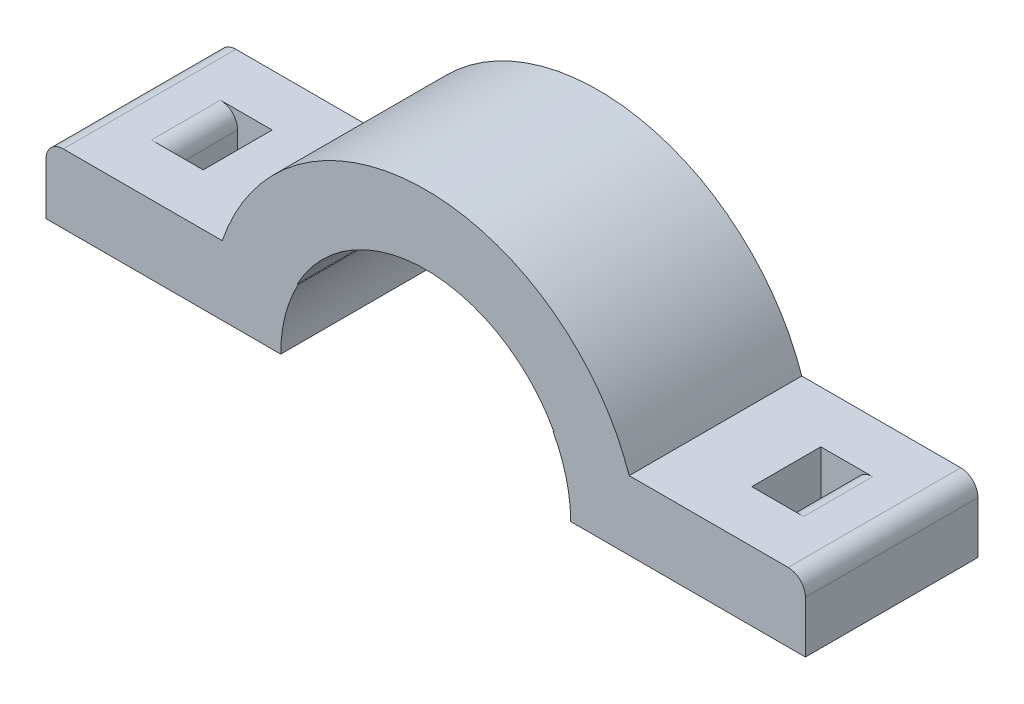
ISO-10303-21;
HEADER;
FILE_DESCRIPTION(('STEP AP214'),'2;1');
FILE_NAME('part.step','',(''),(''),'','','');
FILE_SCHEMA(('AUTOMOTIVE_DESIGN { 1 0 10303 214 1 1 1 1 }'));
ENDSEC;
DATA;
#1=APPLICATION_CONTEXT('core data for automotive mechanical design processes');
#2=APPLICATION_PROTOCOL_DEFINITION('international standard','automotive_design',2000,#1);
#3=PRODUCT_CONTEXT('',#1,'mechanical');
#4=PRODUCT('Part','Part','',(#3));
#5=PRODUCT_RELATED_PRODUCT_CATEGORY('part','',(#4));
#6=PRODUCT_DEFINITION_FORMATION('','',#4);
#7=PRODUCT_DEFINITION_CONTEXT('part definition',#1,'design');
#8=PRODUCT_DEFINITION('design','',#6,#7);
#9=PRODUCT_DEFINITION_SHAPE('','',#8);
#10=(LENGTH_UNIT() NAMED_UNIT(*) SI_UNIT(.MILLI.,.METRE.));
#11=(NAMED_UNIT(*) PLANE_ANGLE_UNIT() SI_UNIT($,.RADIAN.));
#12=(NAMED_UNIT(*) SI_UNIT($,.STERADIAN.) SOLID_ANGLE_UNIT());
#13=UNCERTAINTY_MEASURE_WITH_UNIT(LENGTH_MEASURE(1.E-05),#10,'distance_accuracy_value','');
#14=(GEOMETRIC_REPRESENTATION_CONTEXT(3) GLOBAL_UNCERTAINTY_ASSIGNED_CONTEXT((#13)) GLOBAL_UNIT_ASSIGNED_CONTEXT((#10,
#11,#12)) REPRESENTATION_CONTEXT('',''));
#15=CARTESIAN_POINT('',(0.,0.,0.));
#16=DIRECTION('',(0.,0.,1.));
#17=DIRECTION('',(1.,0.,0.));
#18=AXIS2_PLACEMENT_3D('',#15,#16,#17);
#19=CARTESIAN_POINT('',(10.7315,0.,12.7));
#20=DIRECTION('',(0.,1.,0.));
#21=DIRECTION('',(0.,0.,1.));
#22=AXIS2_PLACEMENT_3D('',#19,#20,#21);
#23=PLANE('',#22);
#24=DIRECTION('',(-1.,0.,0.));
#25=VECTOR('',#24,1.);
#26=CARTESIAN_POINT('',(-22.7266069125138,0.,8.89));
#27=LINE('',#26,#25);
#28=CARTESIAN_POINT('',(-20.1866069125138,0.,8.89));
#29=VERTEX_POINT('',#28);
#30=CARTESIAN_POINT('',(-22.7266069125138,0.,8.89));
#31=VERTEX_POINT('',#30);
#32=EDGE_CURVE('E240',#29,#31,#27,.T.);
#33=ORIENTED_EDGE('',*,*,#32,.F.);
#34=DIRECTION('',(0.,0.,1.));
#35=VECTOR('',#34,1.);
#36=CARTESIAN_POINT('',(-20.1866069125138,0.,3.80999999999999));
#37=LINE('',#36,#35);
#38=CARTESIAN_POINT('',(-20.1866069125138,0.,3.80999999999999));
#39=VERTEX_POINT('',#38);
#40=EDGE_CURVE('E213',#39,#29,#37,.T.);
#41=ORIENTED_EDGE('',*,*,#40,.F.);
#42=DIRECTION('',(1.,0.,0.));
#43=VECTOR('',#42,1.);
#44=CARTESIAN_POINT('',(-22.7266069125138,0.,3.80999999999999));
#45=LINE('',#44,#43);
#46=CARTESIAN_POINT('',(-22.7266069125138,0.,3.80999999999999));
#47=VERTEX_POINT('',#46);
#48=EDGE_CURVE('E219',#47,#39,#45,.T.);
#49=ORIENTED_EDGE('',*,*,#48,.F.);
#50=DIRECTION('',(0.,0.,-1.));
#51=VECTOR('',#50,1.);
#52=CARTESIAN_POINT('',(-22.7266069125138,0.,3.80999999999999));
#53=LINE('',#52,#51);
#54=EDGE_CURVE('E247',#31,#47,#53,.T.);
#55=ORIENTED_EDGE('',*,*,#54,.F.);
#56=EDGE_LOOP('',(#33,#41,#49,#55));
#57=FACE_BOUND('',#56,.T.);
#58=DIRECTION('',(1.,0.,0.));
#59=VECTOR('',#58,1.);
#60=CARTESIAN_POINT('',(10.7315,0.,0.));
#61=LINE('',#60,#59);
#62=CARTESIAN_POINT('',(-27.94,0.,0.));
#63=VERTEX_POINT('',#62);
#64=CARTESIAN_POINT('',(-10.668,0.,0.));
#65=VERTEX_POINT('',#64);
#66=EDGE_CURVE('E370',#63,#65,#61,.T.);
#67=ORIENTED_EDGE('',*,*,#66,.T.);
#68=DIRECTION('',(0.,0.,1.));
#69=VECTOR('',#68,1.);
#70=CARTESIAN_POINT('',(-10.668,0.,-31.496));
#71=LINE('',#70,#69);
#72=CARTESIAN_POINT('',(-10.668,0.,12.7));
#73=VERTEX_POINT('',#72);
#74=EDGE_CURVE('E305',#65,#73,#71,.T.);
#75=ORIENTED_EDGE('',*,*,#74,.T.);
#76=DIRECTION('',(1.,0.,0.));
#77=VECTOR('',#76,1.);
#78=CARTESIAN_POINT('',(-15.8115,0.,12.7));
#79=LINE('',#78,#77);
#80=CARTESIAN_POINT('',(-27.94,0.,12.7));
#81=VERTEX_POINT('',#80);
#82=EDGE_CURVE('E371',#81,#73,#79,.T.);
#83=ORIENTED_EDGE('',*,*,#82,.F.);
#84=DIRECTION('',(0.,0.,-1.));
#85=VECTOR('',#84,1.);
#86=CARTESIAN_POINT('',(-27.94,0.,12.7));
#87=LINE('',#86,#85);
#88=EDGE_CURVE('E330',#81,#63,#87,.T.);
#89=ORIENTED_EDGE('',*,*,#88,.T.);
#90=EDGE_LOOP('',(#67,#75,#83,#89));
#91=FACE_BOUND('',#90,.T.);
#92=ADVANCED_FACE('F45',(#57,#91),#23,.F.);
#93=CARTESIAN_POINT('',(27.94,5.08,12.7));
#94=DIRECTION('',(0.,-1.,0.));
#95=DIRECTION('',(0.,0.,-1.));
#96=AXIS2_PLACEMENT_3D('',#93,#94,#95);
#97=PLANE('',#96);
#98=DIRECTION('',(-1.,0.,0.));
#99=VECTOR('',#98,1.);
#100=CARTESIAN_POINT('',(27.94,5.08,0.));
#101=LINE('',#100,#99);
#102=CARTESIAN_POINT('',(9.45297266736766,5.08,0.));
#103=VERTEX_POINT('',#102);
#104=CARTESIAN_POINT('',(9.38082213881064,5.08,0.));
#105=VERTEX_POINT('',#104);
#106=EDGE_CURVE('E347',#103,#105,#101,.T.);
#107=ORIENTED_EDGE('',*,*,#106,.T.);
#108=DIRECTION('',(0.,0.,1.));
#109=VECTOR('',#108,1.);
#110=CARTESIAN_POINT('',(9.38082213881064,5.08,-31.496));
#111=LINE('',#110,#109);
#112=CARTESIAN_POINT('',(9.38082213881064,5.08,12.7));
#113=VERTEX_POINT('',#112);
#114=EDGE_CURVE('E392',#105,#113,#111,.T.);
#115=ORIENTED_EDGE('',*,*,#114,.T.);
#116=DIRECTION('',(-1.,0.,0.));
#117=VECTOR('',#116,1.);
#118=CARTESIAN_POINT('',(27.94,5.08,12.7));
#119=LINE('',#118,#117);
#120=CARTESIAN_POINT('',(9.45297266736766,5.08,12.7));
#121=VERTEX_POINT('',#120);
#122=EDGE_CURVE('E341',#121,#113,#119,.T.);
#123=ORIENTED_EDGE('',*,*,#122,.F.);
#124=DIRECTION('',(0.,0.,-1.));
#125=VECTOR('',#124,1.);
#126=CARTESIAN_POINT('',(9.45297266736766,5.08,12.7));
#127=LINE('',#126,#125);
#128=EDGE_CURVE('E346',#121,#103,#127,.T.);
#129=ORIENTED_EDGE('',*,*,#128,.T.);
#130=EDGE_LOOP('',(#107,#115,#123,#129));
#131=FACE_BOUND('',#130,.T.);
#132=ADVANCED_FACE('F474',(#131),#97,.F.);
#133=CARTESIAN_POINT('',(0.,0.,12.7));
#134=DIRECTION('',(0.,0.,-1.));
#135=DIRECTION('',(-1.,0.,0.));
#136=AXIS2_PLACEMENT_3D('',#133,#134,#135);
#137=CYLINDRICAL_SURFACE('',#136,15.8115);
#138=DIRECTION('',(0.,0.,-1.));
#139=VECTOR('',#138,1.);
#140=CARTESIAN_POINT('',(-14.9732138250277,5.08,12.7));
#141=LINE('',#140,#139);
#142=CARTESIAN_POINT('',(-14.9732138250277,5.08,12.7));
#143=VERTEX_POINT('',#142);
#144=CARTESIAN_POINT('',(-14.9732138250277,5.08,0.));
#145=VERTEX_POINT('',#144);
#146=EDGE_CURVE('E360',#143,#145,#141,.T.);
#147=ORIENTED_EDGE('',*,*,#146,.F.);
#148=CARTESIAN_POINT('',(0.,0.,12.7));
#149=DIRECTION('',(0.,0.,1.));
#150=DIRECTION('',(1.,0.,0.));
#151=AXIS2_PLACEMENT_3D('',#148,#149,#150);
#152=CIRCLE('',#151,15.8115);
#153=CARTESIAN_POINT('',(14.9732138250277,5.08,12.7));
#154=VERTEX_POINT('',#153);
#155=EDGE_CURVE('E365',#154,#143,#152,.T.);
#156=ORIENTED_EDGE('',*,*,#155,.F.);
#157=DIRECTION('',(0.,0.,-1.));
#158=VECTOR('',#157,1.);
#159=CARTESIAN_POINT('',(14.9732138250277,5.08,12.7));
#160=LINE('',#159,#158);
#161=CARTESIAN_POINT('',(14.9732138250277,5.08,0.));
#162=VERTEX_POINT('',#161);
#163=EDGE_CURVE('E356',#162,#154,#160,.F.);
#164=ORIENTED_EDGE('',*,*,#163,.F.);
#165=CARTESIAN_POINT('',(0.,0.,0.));
#166=DIRECTION('',(0.,0.,1.));
#167=DIRECTION('',(1.,0.,0.));
#168=AXIS2_PLACEMENT_3D('',#165,#166,#167);
#169=CIRCLE('',#168,15.8115);
#170=EDGE_CURVE('E364',#162,#145,#169,.T.);
#171=ORIENTED_EDGE('',*,*,#170,.T.);
#172=EDGE_LOOP('',(#147,#156,#164,#171));
#173=FACE_BOUND('',#172,.T.);
#174=ADVANCED_FACE('F482',(#173),#137,.T.);
#175=CARTESIAN_POINT('',(0.,0.,12.7));
#176=DIRECTION('',(0.,0.,-1.));
#177=DIRECTION('',(-1.,0.,0.));
#178=AXIS2_PLACEMENT_3D('',#175,#176,#177);
#179=CYLINDRICAL_SURFACE('',#178,10.7315);
#180=DIRECTION('',(0.,0.,-1.));
#181=VECTOR('',#180,1.);
#182=CARTESIAN_POINT('',(-9.45297266736766,5.08,12.7));
#183=LINE('',#182,#181);
#184=CARTESIAN_POINT('',(-9.45297266736766,5.08,0.));
#185=VERTEX_POINT('',#184);
#186=CARTESIAN_POINT('',(-9.45297266736766,5.08,12.7));
#187=VERTEX_POINT('',#186);
#188=EDGE_CURVE('E352',#185,#187,#183,.F.);
#189=ORIENTED_EDGE('',*,*,#188,.F.);
#190=CARTESIAN_POINT('',(0.,0.,0.));
#191=DIRECTION('',(0.,0.,-1.));
#192=DIRECTION('',(1.,0.,0.));
#193=AXIS2_PLACEMENT_3D('',#190,#191,#192);
#194=CIRCLE('',#193,10.7315);
#195=EDGE_CURVE('E382',#185,#103,#194,.T.);
#196=ORIENTED_EDGE('',*,*,#195,.T.);
#197=ORIENTED_EDGE('',*,*,#128,.F.);
#198=CARTESIAN_POINT('',(0.,0.,12.7));
#199=DIRECTION('',(0.,0.,-1.));
#200=DIRECTION('',(1.,0.,0.));
#201=AXIS2_PLACEMENT_3D('',#198,#199,#200);
#202=CIRCLE('',#201,10.7315);
#203=EDGE_CURVE('E375',#187,#121,#202,.T.);
#204=ORIENTED_EDGE('',*,*,#203,.F.);
#205=EDGE_LOOP('',(#189,#196,#197,#204));
#206=FACE_BOUND('',#205,.T.);
#207=ADVANCED_FACE('F489',(#206),#179,.F.);
#208=DIRECTION('',(-1.,0.,0.));
#209=VECTOR('',#208,1.);
#210=CARTESIAN_POINT('',(20.1866069125138,0.,8.89000000000001));
#211=LINE('',#210,#209);
#212=CARTESIAN_POINT('',(22.7266069125138,0.,8.89000000000001));
#213=VERTEX_POINT('',#212);
#214=CARTESIAN_POINT('',(20.1866069125138,0.,8.89000000000001));
#215=VERTEX_POINT('',#214);
#216=EDGE_CURVE('E284',#213,#215,#211,.T.);
#217=ORIENTED_EDGE('',*,*,#216,.F.);
#218=DIRECTION('',(0.,0.,1.));
#219=VECTOR('',#218,1.);
#220=CARTESIAN_POINT('',(22.7266069125138,0.,3.81));
#221=LINE('',#220,#219);
#222=CARTESIAN_POINT('',(22.7266069125138,0.,3.81));
#223=VERTEX_POINT('',#222);
#224=EDGE_CURVE('E288',#223,#213,#221,.T.);
#225=ORIENTED_EDGE('',*,*,#224,.F.);
#226=DIRECTION('',(1.,0.,0.));
#227=VECTOR('',#226,1.);
#228=CARTESIAN_POINT('',(20.1866069125138,0.,3.81));
#229=LINE('',#228,#227);
#230=CARTESIAN_POINT('',(20.1866069125138,0.,3.81));
#231=VERTEX_POINT('',#230);
#232=EDGE_CURVE('E268',#231,#223,#229,.T.);
#233=ORIENTED_EDGE('',*,*,#232,.F.);
#234=DIRECTION('',(0.,0.,-1.));
#235=VECTOR('',#234,1.);
#236=CARTESIAN_POINT('',(20.1866069125138,0.,3.81));
#237=LINE('',#236,#235);
#238=EDGE_CURVE('E280',#215,#231,#237,.T.);
#239=ORIENTED_EDGE('',*,*,#238,.F.);
#240=EDGE_LOOP('',(#217,#225,#233,#239));
#241=FACE_BOUND('',#240,.T.);
#242=CARTESIAN_POINT('',(10.668,0.,12.7));
#243=VERTEX_POINT('',#242);
#244=CARTESIAN_POINT('',(27.94,0.,12.7));
#245=VERTEX_POINT('',#244);
#246=EDGE_CURVE('E369',#243,#245,#79,.T.);
#247=ORIENTED_EDGE('',*,*,#246,.F.);
#248=DIRECTION('',(0.,0.,1.));
#249=VECTOR('',#248,1.);
#250=CARTESIAN_POINT('',(10.668,0.,-31.496));
#251=LINE('',#250,#249);
#252=CARTESIAN_POINT('',(10.668,0.,0.));
#253=VERTEX_POINT('',#252);
#254=EDGE_CURVE('E310',#243,#253,#251,.F.);
#255=ORIENTED_EDGE('',*,*,#254,.T.);
#256=CARTESIAN_POINT('',(27.94,0.,0.));
#257=VERTEX_POINT('',#256);
#258=EDGE_CURVE('E385',#253,#257,#61,.T.);
#259=ORIENTED_EDGE('',*,*,#258,.T.);
#260=DIRECTION('',(0.,0.,-1.));
#261=VECTOR('',#260,1.);
#262=CARTESIAN_POINT('',(27.94,0.,12.7));
#263=LINE('',#262,#261);
#264=EDGE_CURVE('E318',#245,#257,#263,.T.);
#265=ORIENTED_EDGE('',*,*,#264,.F.);
#266=EDGE_LOOP('',(#247,#255,#259,#265));
#267=FACE_BOUND('',#266,.T.);
#268=ADVANCED_FACE('F458',(#241,#267),#23,.F.);
#269=CARTESIAN_POINT('',(0.,0.,12.7));
#270=DIRECTION('',(0.,0.,1.));
#271=DIRECTION('',(1.,0.,0.));
#272=AXIS2_PLACEMENT_3D('',#269,#270,#271);
#273=PLANE('',#272);
#274=CARTESIAN_POINT('',(-26.67,5.08,12.7));
#275=VERTEX_POINT('',#274);
#276=EDGE_CURVE('E327',#143,#275,#119,.T.);
#277=ORIENTED_EDGE('',*,*,#276,.T.);
#278=CARTESIAN_POINT('',(-26.67,3.81,12.7));
#279=DIRECTION('',(0.,0.,1.));
#280=DIRECTION('',(1.,0.,0.));
#281=AXIS2_PLACEMENT_3D('',#278,#279,#280);
#282=CIRCLE('',#281,1.27);
#283=CARTESIAN_POINT('',(-27.94,3.81,12.7));
#284=VERTEX_POINT('',#283);
#285=EDGE_CURVE('E406',#275,#284,#282,.T.);
#286=ORIENTED_EDGE('',*,*,#285,.T.);
#287=DIRECTION('',(0.,-1.,0.));
#288=VECTOR('',#287,1.);
#289=CARTESIAN_POINT('',(-27.94,0.,12.7));
#290=LINE('',#289,#288);
#291=EDGE_CURVE('E314',#284,#81,#290,.T.);
#292=ORIENTED_EDGE('',*,*,#291,.T.);
#293=ORIENTED_EDGE('',*,*,#82,.T.);
#294=CARTESIAN_POINT('',(0.,0.,12.7));
#295=DIRECTION('',(0.,0.,1.));
#296=DIRECTION('',(1.,0.,0.));
#297=AXIS2_PLACEMENT_3D('',#294,#295,#296);
#298=CIRCLE('',#297,10.668);
#299=CARTESIAN_POINT('',(-9.38082213881064,5.08,12.7));
#300=VERTEX_POINT('',#299);
#301=EDGE_CURVE('E230',#300,#73,#298,.T.);
#302=ORIENTED_EDGE('',*,*,#301,.F.);
#303=EDGE_CURVE('E342',#300,#187,#119,.T.);
#304=ORIENTED_EDGE('',*,*,#303,.T.);
#305=ORIENTED_EDGE('',*,*,#203,.T.);
#306=ORIENTED_EDGE('',*,*,#122,.T.);
#307=EDGE_CURVE('E298',#243,#113,#298,.T.);
#308=ORIENTED_EDGE('',*,*,#307,.F.);
#309=ORIENTED_EDGE('',*,*,#246,.T.);
#310=DIRECTION('',(0.,-1.,0.));
#311=VECTOR('',#310,1.);
#312=CARTESIAN_POINT('',(27.94,0.,12.7));
#313=LINE('',#312,#311);
#314=CARTESIAN_POINT('',(27.94,3.81,12.7));
#315=VERTEX_POINT('',#314);
#316=EDGE_CURVE('E315',#315,#245,#313,.T.);
#317=ORIENTED_EDGE('',*,*,#316,.F.);
#318=CARTESIAN_POINT('',(26.67,3.81,12.7));
#319=DIRECTION('',(0.,0.,1.));
#320=DIRECTION('',(1.,0.,0.));
#321=AXIS2_PLACEMENT_3D('',#318,#319,#320);
#322=CIRCLE('',#321,1.27);
#323=CARTESIAN_POINT('',(26.67,5.08,12.7));
#324=VERTEX_POINT('',#323);
#325=EDGE_CURVE('E403',#315,#324,#322,.T.);
#326=ORIENTED_EDGE('',*,*,#325,.T.);
#327=EDGE_CURVE('E337',#324,#154,#119,.T.);
#328=ORIENTED_EDGE('',*,*,#327,.T.);
#329=ORIENTED_EDGE('',*,*,#155,.T.);
#330=EDGE_LOOP('',(#277,#286,#292,#293,#302,#304,#305,#306,#308,#309,#317,#326,#328,#329));
#331=FACE_BOUND('',#330,.T.);
#332=ADVANCED_FACE('F488',(#331),#273,.T.);
#333=CARTESIAN_POINT('',(0.,0.,0.));
#334=DIRECTION('',(0.,0.,1.));
#335=DIRECTION('',(1.,0.,0.));
#336=AXIS2_PLACEMENT_3D('',#333,#334,#335);
#337=PLANE('',#336);
#338=DIRECTION('',(0.,1.,0.));
#339=VECTOR('',#338,1.);
#340=CARTESIAN_POINT('',(-27.94,0.,0.));
#341=LINE('',#340,#339);
#342=CARTESIAN_POINT('',(-27.94,3.81,0.));
#343=VERTEX_POINT('',#342);
#344=EDGE_CURVE('E319',#63,#343,#341,.T.);
#345=ORIENTED_EDGE('',*,*,#344,.T.);
#346=CARTESIAN_POINT('',(-26.67,3.81,0.));
#347=DIRECTION('',(0.,0.,1.));
#348=DIRECTION('',(1.,0.,0.));
#349=AXIS2_PLACEMENT_3D('',#346,#347,#348);
#350=CIRCLE('',#349,1.27);
#351=CARTESIAN_POINT('',(-26.67,5.08,0.));
#352=VERTEX_POINT('',#351);
#353=EDGE_CURVE('E415',#343,#352,#350,.F.);
#354=ORIENTED_EDGE('',*,*,#353,.T.);
#355=EDGE_CURVE('E340',#145,#352,#101,.T.);
#356=ORIENTED_EDGE('',*,*,#355,.F.);
#357=ORIENTED_EDGE('',*,*,#170,.F.);
#358=CARTESIAN_POINT('',(26.67,5.08,0.));
#359=VERTEX_POINT('',#358);
#360=EDGE_CURVE('E343',#359,#162,#101,.T.);
#361=ORIENTED_EDGE('',*,*,#360,.F.);
#362=CARTESIAN_POINT('',(26.67,3.81,0.));
#363=DIRECTION('',(0.,0.,1.));
#364=DIRECTION('',(1.,0.,0.));
#365=AXIS2_PLACEMENT_3D('',#362,#363,#364);
#366=CIRCLE('',#365,1.27);
#367=CARTESIAN_POINT('',(27.94,3.81,0.));
#368=VERTEX_POINT('',#367);
#369=EDGE_CURVE('E412',#359,#368,#366,.F.);
#370=ORIENTED_EDGE('',*,*,#369,.T.);
#371=DIRECTION('',(0.,1.,0.));
#372=VECTOR('',#371,1.);
#373=CARTESIAN_POINT('',(27.94,0.,0.));
#374=LINE('',#373,#372);
#375=EDGE_CURVE('E323',#257,#368,#374,.T.);
#376=ORIENTED_EDGE('',*,*,#375,.F.);
#377=ORIENTED_EDGE('',*,*,#258,.F.);
#378=CARTESIAN_POINT('',(0.,0.,0.));
#379=DIRECTION('',(0.,0.,1.));
#380=DIRECTION('',(1.,0.,0.));
#381=AXIS2_PLACEMENT_3D('',#378,#379,#380);
#382=CIRCLE('',#381,10.668);
#383=EDGE_CURVE('E306',#253,#105,#382,.T.);
#384=ORIENTED_EDGE('',*,*,#383,.T.);
#385=ORIENTED_EDGE('',*,*,#106,.F.);
#386=ORIENTED_EDGE('',*,*,#195,.F.);
#387=CARTESIAN_POINT('',(-9.38082213881064,5.08,0.));
#388=VERTEX_POINT('',#387);
#389=EDGE_CURVE('E348',#388,#185,#101,.T.);
#390=ORIENTED_EDGE('',*,*,#389,.F.);
#391=EDGE_CURVE('E301',#388,#65,#382,.T.);
#392=ORIENTED_EDGE('',*,*,#391,.T.);
#393=ORIENTED_EDGE('',*,*,#66,.F.);
#394=EDGE_LOOP('',(#345,#354,#356,#357,#361,#370,#376,#377,#384,#385,#386,#390,#392,#393));
#395=FACE_BOUND('',#394,.T.);
#396=ADVANCED_FACE('F494',(#395),#337,.F.);
#397=ORIENTED_EDGE('',*,*,#303,.F.);
#398=DIRECTION('',(0.,0.,1.));
#399=VECTOR('',#398,1.);
#400=CARTESIAN_POINT('',(-9.38082213881064,5.08,-31.496));
#401=LINE('',#400,#399);
#402=EDGE_CURVE('E379',#300,#388,#401,.F.);
#403=ORIENTED_EDGE('',*,*,#402,.T.);
#404=ORIENTED_EDGE('',*,*,#389,.T.);
#405=ORIENTED_EDGE('',*,*,#188,.T.);
#406=EDGE_LOOP('',(#397,#403,#404,#405));
#407=FACE_BOUND('',#406,.T.);
#408=ADVANCED_FACE('F550',(#407),#97,.F.);
#409=CARTESIAN_POINT('',(27.94,0.,0.));
#410=DIRECTION('',(-1.,0.,0.));
#411=DIRECTION('',(0.,0.,1.));
#412=AXIS2_PLACEMENT_3D('',#409,#410,#411);
#413=PLANE('',#412);
#414=ORIENTED_EDGE('',*,*,#375,.T.);
#415=DIRECTION('',(0.,0.,1.));
#416=VECTOR('',#415,1.);
#417=CARTESIAN_POINT('',(27.94,3.81,0.));
#418=LINE('',#417,#416);
#419=EDGE_CURVE('E418',#368,#315,#418,.T.);
#420=ORIENTED_EDGE('',*,*,#419,.T.);
#421=ORIENTED_EDGE('',*,*,#316,.T.);
#422=ORIENTED_EDGE('',*,*,#264,.T.);
#423=EDGE_LOOP('',(#414,#420,#421,#422));
#424=FACE_BOUND('',#423,.T.);
#425=ADVANCED_FACE('F547',(#424),#413,.F.);
#426=DIRECTION('',(-1.,0.,0.));
#427=VECTOR('',#426,1.);
#428=CARTESIAN_POINT('',(20.1866069125138,5.08,3.81));
#429=LINE('',#428,#427);
#430=CARTESIAN_POINT('',(23.9966069125138,5.08,3.81));
#431=VERTEX_POINT('',#430);
#432=CARTESIAN_POINT('',(20.1866069125138,5.08,3.81));
#433=VERTEX_POINT('',#432);
#434=EDGE_CURVE('E292',#431,#433,#429,.T.);
#435=ORIENTED_EDGE('',*,*,#434,.F.);
#436=DIRECTION('',(0.,0.,-1.));
#437=VECTOR('',#436,1.);
#438=CARTESIAN_POINT('',(23.9966069125138,5.08,12.7));
#439=LINE('',#438,#437);
#440=CARTESIAN_POINT('',(23.9966069125138,5.08,8.89000000000001));
#441=VERTEX_POINT('',#440);
#442=EDGE_CURVE('E422',#431,#441,#439,.F.);
#443=ORIENTED_EDGE('',*,*,#442,.T.);
#444=DIRECTION('',(1.,0.,0.));
#445=VECTOR('',#444,1.);
#446=CARTESIAN_POINT('',(20.1866069125138,5.08,8.89000000000001));
#447=LINE('',#446,#445);
#448=CARTESIAN_POINT('',(20.1866069125138,5.08,8.89000000000001));
#449=VERTEX_POINT('',#448);
#450=EDGE_CURVE('E261',#449,#441,#447,.T.);
#451=ORIENTED_EDGE('',*,*,#450,.F.);
#452=DIRECTION('',(0.,0.,1.));
#453=VECTOR('',#452,1.);
#454=CARTESIAN_POINT('',(20.1866069125138,5.08,3.81));
#455=LINE('',#454,#453);
#456=EDGE_CURVE('E242',#433,#449,#455,.T.);
#457=ORIENTED_EDGE('',*,*,#456,.F.);
#458=EDGE_LOOP('',(#435,#443,#451,#457));
#459=FACE_BOUND('',#458,.T.);
#460=ORIENTED_EDGE('',*,*,#327,.F.);
#461=DIRECTION('',(0.,0.,1.));
#462=VECTOR('',#461,1.);
#463=CARTESIAN_POINT('',(26.67,5.08,12.7));
#464=LINE('',#463,#462);
#465=EDGE_CURVE('E426',#324,#359,#464,.F.);
#466=ORIENTED_EDGE('',*,*,#465,.T.);
#467=ORIENTED_EDGE('',*,*,#360,.T.);
#468=ORIENTED_EDGE('',*,*,#163,.T.);
#469=EDGE_LOOP('',(#460,#466,#467,#468));
#470=FACE_BOUND('',#469,.T.);
#471=ADVANCED_FACE('F447',(#459,#470),#97,.F.);
#472=DIRECTION('',(1.,0.,0.));
#473=VECTOR('',#472,1.);
#474=CARTESIAN_POINT('',(-22.7266069125138,5.08,8.89));
#475=LINE('',#474,#473);
#476=CARTESIAN_POINT('',(-23.9966069125138,5.08,8.89));
#477=VERTEX_POINT('',#476);
#478=CARTESIAN_POINT('',(-20.1866069125138,5.08,8.89));
#479=VERTEX_POINT('',#478);
#480=EDGE_CURVE('E222',#477,#479,#475,.T.);
#481=ORIENTED_EDGE('',*,*,#480,.F.);
#482=DIRECTION('',(0.,0.,1.));
#483=VECTOR('',#482,1.);
#484=CARTESIAN_POINT('',(-23.9966069125138,5.08,12.7));
#485=LINE('',#484,#483);
#486=CARTESIAN_POINT('',(-23.9966069125138,5.08,3.80999999999999));
#487=VERTEX_POINT('',#486);
#488=EDGE_CURVE('E396',#477,#487,#485,.F.);
#489=ORIENTED_EDGE('',*,*,#488,.T.);
#490=DIRECTION('',(-1.,0.,0.));
#491=VECTOR('',#490,1.);
#492=CARTESIAN_POINT('',(-22.7266069125138,5.08,3.80999999999999));
#493=LINE('',#492,#491);
#494=CARTESIAN_POINT('',(-20.1866069125138,5.08,3.80999999999999));
#495=VERTEX_POINT('',#494);
#496=EDGE_CURVE('E235',#495,#487,#493,.T.);
#497=ORIENTED_EDGE('',*,*,#496,.F.);
#498=DIRECTION('',(0.,0.,-1.));
#499=VECTOR('',#498,1.);
#500=CARTESIAN_POINT('',(-20.1866069125138,5.08,3.80999999999999));
#501=LINE('',#500,#499);
#502=EDGE_CURVE('E210',#479,#495,#501,.T.);
#503=ORIENTED_EDGE('',*,*,#502,.F.);
#504=EDGE_LOOP('',(#481,#489,#497,#503));
#505=FACE_BOUND('',#504,.T.);
#506=ORIENTED_EDGE('',*,*,#355,.T.);
#507=DIRECTION('',(0.,0.,1.));
#508=VECTOR('',#507,1.);
#509=CARTESIAN_POINT('',(-26.67,5.08,12.7));
#510=LINE('',#509,#508);
#511=EDGE_CURVE('E399',#352,#275,#510,.T.);
#512=ORIENTED_EDGE('',*,*,#511,.T.);
#513=ORIENTED_EDGE('',*,*,#276,.F.);
#514=ORIENTED_EDGE('',*,*,#146,.T.);
#515=EDGE_LOOP('',(#506,#512,#513,#514));
#516=FACE_BOUND('',#515,.T.);
#517=ADVANCED_FACE('F233',(#505,#516),#97,.F.);
#518=CARTESIAN_POINT('',(-27.94,0.,0.));
#519=DIRECTION('',(-1.,0.,0.));
#520=DIRECTION('',(0.,0.,1.));
#521=AXIS2_PLACEMENT_3D('',#518,#519,#520);
#522=PLANE('',#521);
#523=ORIENTED_EDGE('',*,*,#291,.F.);
#524=DIRECTION('',(0.,0.,1.));
#525=VECTOR('',#524,1.);
#526=CARTESIAN_POINT('',(-27.94,3.81,0.));
#527=LINE('',#526,#525);
#528=EDGE_CURVE('E409',#284,#343,#527,.F.);
#529=ORIENTED_EDGE('',*,*,#528,.T.);
#530=ORIENTED_EDGE('',*,*,#344,.F.);
#531=ORIENTED_EDGE('',*,*,#88,.F.);
#532=EDGE_LOOP('',(#523,#529,#530,#531));
#533=FACE_BOUND('',#532,.T.);
#534=ADVANCED_FACE('F543',(#533),#522,.T.);
#535=CARTESIAN_POINT('',(0.,0.,-31.496));
#536=DIRECTION('',(0.,0.,1.));
#537=DIRECTION('',(1.,0.,0.));
#538=AXIS2_PLACEMENT_3D('',#535,#536,#537);
#539=CYLINDRICAL_SURFACE('',#538,10.668);
#540=ORIENTED_EDGE('',*,*,#391,.F.);
#541=ORIENTED_EDGE('',*,*,#402,.F.);
#542=ORIENTED_EDGE('',*,*,#301,.T.);
#543=ORIENTED_EDGE('',*,*,#74,.F.);
#544=EDGE_LOOP('',(#540,#541,#542,#543));
#545=FACE_BOUND('',#544,.T.);
#546=ADVANCED_FACE('F537',(#545),#539,.F.);
#547=ORIENTED_EDGE('',*,*,#307,.T.);
#548=ORIENTED_EDGE('',*,*,#114,.F.);
#549=ORIENTED_EDGE('',*,*,#383,.F.);
#550=ORIENTED_EDGE('',*,*,#254,.F.);
#551=EDGE_LOOP('',(#547,#548,#549,#550));
#552=FACE_BOUND('',#551,.T.);
#553=ADVANCED_FACE('F533',(#552),#539,.F.);
#554=CARTESIAN_POINT('',(-20.1866069125138,15.8125,3.80999999999999));
#555=DIRECTION('',(1.,0.,0.));
#556=DIRECTION('',(0.,0.,-1.));
#557=AXIS2_PLACEMENT_3D('',#554,#555,#556);
#558=PLANE('',#557);
#559=ORIENTED_EDGE('',*,*,#502,.T.);
#560=DIRECTION('',(0.,-1.,0.));
#561=VECTOR('',#560,1.);
#562=CARTESIAN_POINT('',(-20.1866069125138,15.8125,3.80999999999999));
#563=LINE('',#562,#561);
#564=EDGE_CURVE('E231',#495,#39,#563,.T.);
#565=ORIENTED_EDGE('',*,*,#564,.T.);
#566=ORIENTED_EDGE('',*,*,#40,.T.);
#567=DIRECTION('',(0.,-1.,0.));
#568=VECTOR('',#567,1.);
#569=CARTESIAN_POINT('',(-20.1866069125138,15.8125,8.89));
#570=LINE('',#569,#568);
#571=EDGE_CURVE('E206',#479,#29,#570,.T.);
#572=ORIENTED_EDGE('',*,*,#571,.F.);
#573=EDGE_LOOP('',(#559,#565,#566,#572));
#574=FACE_BOUND('',#573,.T.);
#575=ADVANCED_FACE('F208',(#574),#558,.F.);
#576=CARTESIAN_POINT('',(-22.7266069125138,15.8125,3.80999999999999));
#577=DIRECTION('',(0.,0.,-1.));
#578=DIRECTION('',(-1.,0.,0.));
#579=AXIS2_PLACEMENT_3D('',#576,#577,#578);
#580=PLANE('',#579);
#581=ORIENTED_EDGE('',*,*,#496,.T.);
#582=CARTESIAN_POINT('',(-23.9966069125138,3.81,3.80999999999999));
#583=DIRECTION('',(0.,0.,-1.));
#584=DIRECTION('',(-1.,0.,0.));
#585=AXIS2_PLACEMENT_3D('',#582,#583,#584);
#586=CIRCLE('',#585,1.27);
#587=CARTESIAN_POINT('',(-22.7266069125138,3.81,3.80999999999999));
#588=VERTEX_POINT('',#587);
#589=EDGE_CURVE('E438',#487,#588,#586,.T.);
#590=ORIENTED_EDGE('',*,*,#589,.T.);
#591=DIRECTION('',(0.,-1.,0.));
#592=VECTOR('',#591,1.);
#593=CARTESIAN_POINT('',(-22.7266069125138,15.8125,3.80999999999999));
#594=LINE('',#593,#592);
#595=EDGE_CURVE('E256',#588,#47,#594,.T.);
#596=ORIENTED_EDGE('',*,*,#595,.T.);
#597=ORIENTED_EDGE('',*,*,#48,.T.);
#598=ORIENTED_EDGE('',*,*,#564,.F.);
#599=EDGE_LOOP('',(#581,#590,#596,#597,#598));
#600=FACE_BOUND('',#599,.T.);
#601=ADVANCED_FACE('F523',(#600),#580,.F.);
#602=CARTESIAN_POINT('',(-22.7266069125138,15.8125,3.80999999999999));
#603=DIRECTION('',(-1.,0.,0.));
#604=DIRECTION('',(0.,0.,1.));
#605=AXIS2_PLACEMENT_3D('',#602,#603,#604);
#606=PLANE('',#605);
#607=ORIENTED_EDGE('',*,*,#595,.F.);
#608=DIRECTION('',(0.,0.,1.));
#609=VECTOR('',#608,1.);
#610=CARTESIAN_POINT('',(-22.7266069125138,3.81,3.80999999999999));
#611=LINE('',#610,#609);
#612=CARTESIAN_POINT('',(-22.7266069125138,3.81,8.89));
#613=VERTEX_POINT('',#612);
#614=EDGE_CURVE('E429',#588,#613,#611,.T.);
#615=ORIENTED_EDGE('',*,*,#614,.T.);
#616=DIRECTION('',(0.,-1.,0.));
#617=VECTOR('',#616,1.);
#618=CARTESIAN_POINT('',(-22.7266069125138,15.8125,8.89));
#619=LINE('',#618,#617);
#620=EDGE_CURVE('E218',#613,#31,#619,.T.);
#621=ORIENTED_EDGE('',*,*,#620,.T.);
#622=ORIENTED_EDGE('',*,*,#54,.T.);
#623=EDGE_LOOP('',(#607,#615,#621,#622));
#624=FACE_BOUND('',#623,.T.);
#625=ADVANCED_FACE('F469',(#624),#606,.F.);
#626=CARTESIAN_POINT('',(-22.7266069125138,15.8125,8.89));
#627=DIRECTION('',(0.,0.,1.));
#628=DIRECTION('',(1.,0.,0.));
#629=AXIS2_PLACEMENT_3D('',#626,#627,#628);
#630=PLANE('',#629);
#631=ORIENTED_EDGE('',*,*,#480,.T.);
#632=ORIENTED_EDGE('',*,*,#571,.T.);
#633=ORIENTED_EDGE('',*,*,#32,.T.);
#634=ORIENTED_EDGE('',*,*,#620,.F.);
#635=CARTESIAN_POINT('',(-23.9966069125138,3.81,8.89));
#636=DIRECTION('',(0.,0.,1.));
#637=DIRECTION('',(1.,0.,0.));
#638=AXIS2_PLACEMENT_3D('',#635,#636,#637);
#639=CIRCLE('',#638,1.27);
#640=EDGE_CURVE('E225',#613,#477,#639,.T.);
#641=ORIENTED_EDGE('',*,*,#640,.T.);
#642=EDGE_LOOP('',(#631,#632,#633,#634,#641));
#643=FACE_BOUND('',#642,.T.);
#644=ADVANCED_FACE('F223',(#643),#630,.F.);
#645=CARTESIAN_POINT('',(22.7266069125138,15.8125,3.81));
#646=DIRECTION('',(1.,0.,0.));
#647=DIRECTION('',(0.,0.,-1.));
#648=AXIS2_PLACEMENT_3D('',#645,#646,#647);
#649=PLANE('',#648);
#650=DIRECTION('',(0.,-1.,0.));
#651=VECTOR('',#650,1.);
#652=CARTESIAN_POINT('',(22.7266069125138,15.8125,8.89000000000001));
#653=LINE('',#652,#651);
#654=CARTESIAN_POINT('',(22.7266069125138,3.81,8.89000000000001));
#655=VERTEX_POINT('',#654);
#656=EDGE_CURVE('E265',#655,#213,#653,.T.);
#657=ORIENTED_EDGE('',*,*,#656,.F.);
#658=DIRECTION('',(0.,0.,-1.));
#659=VECTOR('',#658,1.);
#660=CARTESIAN_POINT('',(22.7266069125138,3.81,3.81));
#661=LINE('',#660,#659);
#662=CARTESIAN_POINT('',(22.7266069125138,3.81,3.81));
#663=VERTEX_POINT('',#662);
#664=EDGE_CURVE('E433',#655,#663,#661,.T.);
#665=ORIENTED_EDGE('',*,*,#664,.T.);
#666=DIRECTION('',(0.,-1.,0.));
#667=VECTOR('',#666,1.);
#668=CARTESIAN_POINT('',(22.7266069125138,15.8125,3.81));
#669=LINE('',#668,#667);
#670=EDGE_CURVE('E264',#663,#223,#669,.T.);
#671=ORIENTED_EDGE('',*,*,#670,.T.);
#672=ORIENTED_EDGE('',*,*,#224,.T.);
#673=EDGE_LOOP('',(#657,#665,#671,#672));
#674=FACE_BOUND('',#673,.T.);
#675=ADVANCED_FACE('F461',(#674),#649,.F.);
#676=CARTESIAN_POINT('',(20.1866069125138,15.8125,3.81));
#677=DIRECTION('',(0.,0.,-1.));
#678=DIRECTION('',(-1.,0.,0.));
#679=AXIS2_PLACEMENT_3D('',#676,#677,#678);
#680=PLANE('',#679);
#681=ORIENTED_EDGE('',*,*,#434,.T.);
#682=DIRECTION('',(0.,-1.,0.));
#683=VECTOR('',#682,1.);
#684=CARTESIAN_POINT('',(20.1866069125138,15.8125,3.81));
#685=LINE('',#684,#683);
#686=EDGE_CURVE('E272',#433,#231,#685,.T.);
#687=ORIENTED_EDGE('',*,*,#686,.T.);
#688=ORIENTED_EDGE('',*,*,#232,.T.);
#689=ORIENTED_EDGE('',*,*,#670,.F.);
#690=CARTESIAN_POINT('',(23.9966069125138,3.81,3.81));
#691=DIRECTION('',(0.,0.,-1.));
#692=DIRECTION('',(-1.,0.,0.));
#693=AXIS2_PLACEMENT_3D('',#690,#691,#692);
#694=CIRCLE('',#693,1.27);
#695=EDGE_CURVE('E54',#663,#431,#694,.T.);
#696=ORIENTED_EDGE('',*,*,#695,.T.);
#697=EDGE_LOOP('',(#681,#687,#688,#689,#696));
#698=FACE_BOUND('',#697,.T.);
#699=ADVANCED_FACE('F443',(#698),#680,.F.);
#700=CARTESIAN_POINT('',(20.1866069125138,15.8125,3.81));
#701=DIRECTION('',(-1.,0.,0.));
#702=DIRECTION('',(0.,0.,1.));
#703=AXIS2_PLACEMENT_3D('',#700,#701,#702);
#704=PLANE('',#703);
#705=ORIENTED_EDGE('',*,*,#456,.T.);
#706=DIRECTION('',(0.,-1.,0.));
#707=VECTOR('',#706,1.);
#708=CARTESIAN_POINT('',(20.1866069125138,15.8125,8.89000000000001));
#709=LINE('',#708,#707);
#710=EDGE_CURVE('E269',#449,#215,#709,.T.);
#711=ORIENTED_EDGE('',*,*,#710,.T.);
#712=ORIENTED_EDGE('',*,*,#238,.T.);
#713=ORIENTED_EDGE('',*,*,#686,.F.);
#714=EDGE_LOOP('',(#705,#711,#712,#713));
#715=FACE_BOUND('',#714,.T.);
#716=ADVANCED_FACE('F451',(#715),#704,.F.);
#717=CARTESIAN_POINT('',(20.1866069125138,15.8125,8.89000000000001));
#718=DIRECTION('',(0.,0.,1.));
#719=DIRECTION('',(1.,0.,0.));
#720=AXIS2_PLACEMENT_3D('',#717,#718,#719);
#721=PLANE('',#720);
#722=ORIENTED_EDGE('',*,*,#450,.T.);
#723=CARTESIAN_POINT('',(23.9966069125138,3.81,8.89000000000001));
#724=DIRECTION('',(0.,0.,1.));
#725=DIRECTION('',(1.,0.,0.));
#726=AXIS2_PLACEMENT_3D('',#723,#724,#725);
#727=CIRCLE('',#726,1.27);
#728=EDGE_CURVE('E11',#441,#655,#727,.T.);
#729=ORIENTED_EDGE('',*,*,#728,.T.);
#730=ORIENTED_EDGE('',*,*,#656,.T.);
#731=ORIENTED_EDGE('',*,*,#216,.T.);
#732=ORIENTED_EDGE('',*,*,#710,.F.);
#733=EDGE_LOOP('',(#722,#729,#730,#731,#732));
#734=FACE_BOUND('',#733,.T.);
#735=ADVANCED_FACE('F452',(#734),#721,.F.);
#736=CARTESIAN_POINT('',(-26.67,3.81,12.7));
#737=DIRECTION('',(0.,0.,-1.));
#738=DIRECTION('',(-1.,0.,0.));
#739=AXIS2_PLACEMENT_3D('',#736,#737,#738);
#740=CYLINDRICAL_SURFACE('',#739,1.27);
#741=ORIENTED_EDGE('',*,*,#353,.F.);
#742=ORIENTED_EDGE('',*,*,#528,.F.);
#743=ORIENTED_EDGE('',*,*,#285,.F.);
#744=ORIENTED_EDGE('',*,*,#511,.F.);
#745=EDGE_LOOP('',(#741,#742,#743,#744));
#746=FACE_BOUND('',#745,.T.);
#747=ADVANCED_FACE('F506',(#746),#740,.T.);
#748=CARTESIAN_POINT('',(26.67,3.81,0.));
#749=DIRECTION('',(0.,0.,1.));
#750=DIRECTION('',(1.,0.,0.));
#751=AXIS2_PLACEMENT_3D('',#748,#749,#750);
#752=CYLINDRICAL_SURFACE('',#751,1.27);
#753=ORIENTED_EDGE('',*,*,#369,.F.);
#754=ORIENTED_EDGE('',*,*,#465,.F.);
#755=ORIENTED_EDGE('',*,*,#325,.F.);
#756=ORIENTED_EDGE('',*,*,#419,.F.);
#757=EDGE_LOOP('',(#753,#754,#755,#756));
#758=FACE_BOUND('',#757,.T.);
#759=ADVANCED_FACE('F509',(#758),#752,.T.);
#760=CARTESIAN_POINT('',(-23.9966069125138,3.81,3.80999999999999));
#761=DIRECTION('',(0.,0.,1.));
#762=DIRECTION('',(1.,0.,0.));
#763=AXIS2_PLACEMENT_3D('',#760,#761,#762);
#764=CYLINDRICAL_SURFACE('',#763,1.27);
#765=ORIENTED_EDGE('',*,*,#589,.F.);
#766=ORIENTED_EDGE('',*,*,#488,.F.);
#767=ORIENTED_EDGE('',*,*,#640,.F.);
#768=ORIENTED_EDGE('',*,*,#614,.F.);
#769=EDGE_LOOP('',(#765,#766,#767,#768));
#770=FACE_BOUND('',#769,.T.);
#771=ADVANCED_FACE('F512',(#770),#764,.T.);
#772=CARTESIAN_POINT('',(23.9966069125138,3.81,3.81));
#773=DIRECTION('',(0.,0.,-1.));
#774=DIRECTION('',(-1.,0.,0.));
#775=AXIS2_PLACEMENT_3D('',#772,#773,#774);
#776=CYLINDRICAL_SURFACE('',#775,1.27);
#777=ORIENTED_EDGE('',*,*,#728,.F.);
#778=ORIENTED_EDGE('',*,*,#442,.F.);
#779=ORIENTED_EDGE('',*,*,#695,.F.);
#780=ORIENTED_EDGE('',*,*,#664,.F.);
#781=EDGE_LOOP('',(#777,#778,#779,#780));
#782=FACE_BOUND('',#781,.T.);
#783=ADVANCED_FACE('F47',(#782),#776,.T.);
#784=CLOSED_SHELL('',(#92,#132,#174,#207,#268,#332,#396,#408,#425,#471,#517,#534,#546,#553,#575,
#601,#625,#644,#675,#699,#716,#735,#747,#759,#771,#783));
#785=MANIFOLD_SOLID_BREP('B2',#784);
#786=ADVANCED_BREP_SHAPE_REPRESENTATION('',(#18,#785),#14);
#787=SHAPE_DEFINITION_REPRESENTATION(#9,#786);
ENDSEC;
END-ISO-10303-21;
